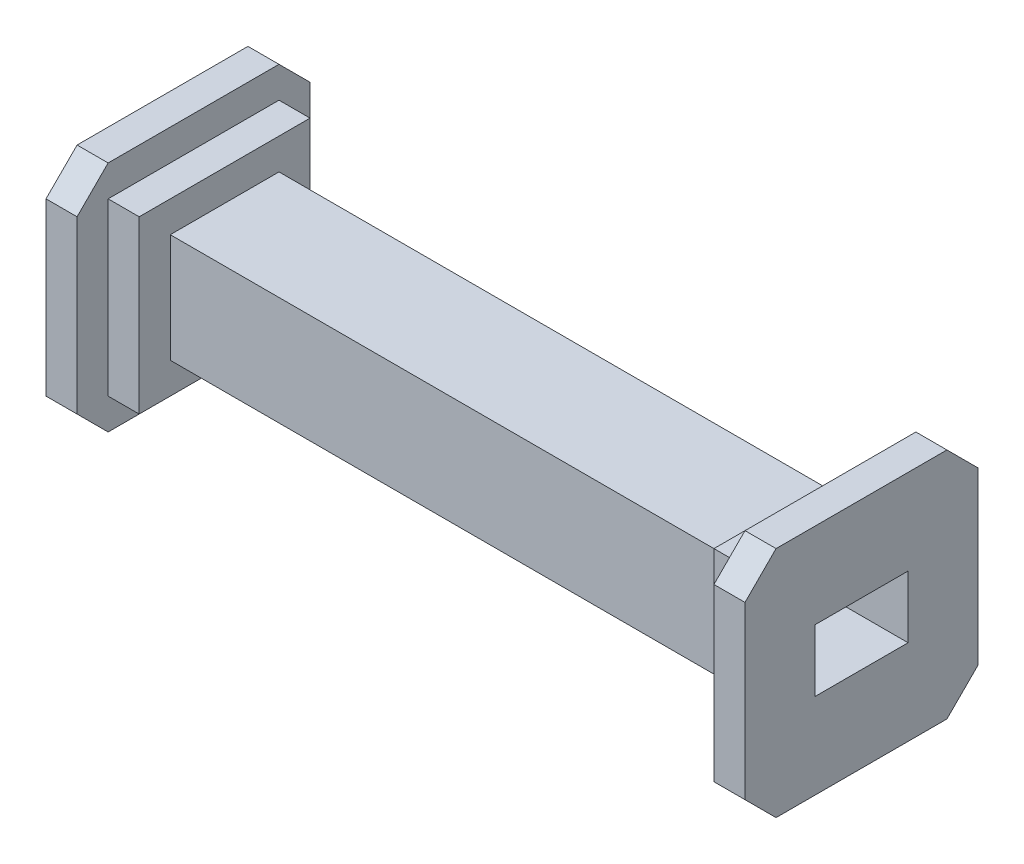
ISO-10303-21;
HEADER;
FILE_DESCRIPTION(('STEP AP214'),'2;1');
FILE_NAME('part.step','',(''),(''),'','','');
FILE_SCHEMA(('AUTOMOTIVE_DESIGN { 1 0 10303 214 1 1 1 1 }'));
ENDSEC;
DATA;
#1=APPLICATION_CONTEXT('core data for automotive mechanical design processes');
#2=APPLICATION_PROTOCOL_DEFINITION('international standard','automotive_design',2000,#1);
#3=PRODUCT_CONTEXT('',#1,'mechanical');
#4=PRODUCT('Part','Part','',(#3));
#5=PRODUCT_RELATED_PRODUCT_CATEGORY('part','',(#4));
#6=PRODUCT_DEFINITION_FORMATION('','',#4);
#7=PRODUCT_DEFINITION_CONTEXT('part definition',#1,'design');
#8=PRODUCT_DEFINITION('design','',#6,#7);
#9=PRODUCT_DEFINITION_SHAPE('','',#8);
#10=(LENGTH_UNIT() NAMED_UNIT(*) SI_UNIT(.MILLI.,.METRE.));
#11=(NAMED_UNIT(*) PLANE_ANGLE_UNIT() SI_UNIT($,.RADIAN.));
#12=(NAMED_UNIT(*) SI_UNIT($,.STERADIAN.) SOLID_ANGLE_UNIT());
#13=UNCERTAINTY_MEASURE_WITH_UNIT(LENGTH_MEASURE(1.E-05),#10,'distance_accuracy_value','');
#14=(GEOMETRIC_REPRESENTATION_CONTEXT(3) GLOBAL_UNCERTAINTY_ASSIGNED_CONTEXT((#13)) GLOBAL_UNIT_ASSIGNED_CONTEXT((#10,
#11,#12)) REPRESENTATION_CONTEXT('',''));
#15=CARTESIAN_POINT('',(0.,0.,0.));
#16=DIRECTION('',(0.,0.,1.));
#17=DIRECTION('',(1.,0.,0.));
#18=AXIS2_PLACEMENT_3D('',#15,#16,#17);
#19=CARTESIAN_POINT('',(5.08,0.,0.));
#20=DIRECTION('',(-1.,0.,0.));
#21=DIRECTION('',(0.,0.,1.));
#22=AXIS2_PLACEMENT_3D('',#19,#20,#21);
#23=PLANE('',#22);
#24=DIRECTION('',(0.,0.,-1.));
#25=VECTOR('',#24,1.);
#26=CARTESIAN_POINT('',(5.08,13.9699999999721,-400000.));
#27=LINE('',#26,#25);
#28=CARTESIAN_POINT('',(5.08,13.9699999999721,13.9699999999721));
#29=VERTEX_POINT('',#28);
#30=CARTESIAN_POINT('',(5.08,13.9699999999721,-13.9699999999721));
#31=VERTEX_POINT('',#30);
#32=EDGE_CURVE('E378',#29,#31,#27,.T.);
#33=ORIENTED_EDGE('',*,*,#32,.T.);
#34=DIRECTION('',(0.,-1.,0.));
#35=VECTOR('',#34,1.);
#36=CARTESIAN_POINT('',(5.08,-291579.045,-13.9699999999721));
#37=LINE('',#36,#35);
#38=CARTESIAN_POINT('',(5.08,-13.9699999999721,-13.9699999999721));
#39=VERTEX_POINT('',#38);
#40=EDGE_CURVE('E400',#31,#39,#37,.T.);
#41=ORIENTED_EDGE('',*,*,#40,.T.);
#42=DIRECTION('',(0.,0.,1.));
#43=VECTOR('',#42,1.);
#44=CARTESIAN_POINT('',(5.08,-13.9699999999721,-400000.));
#45=LINE('',#44,#43);
#46=CARTESIAN_POINT('',(5.08,-13.9699999999721,13.9699999999721));
#47=VERTEX_POINT('',#46);
#48=EDGE_CURVE('E404',#39,#47,#45,.T.);
#49=ORIENTED_EDGE('',*,*,#48,.T.);
#50=DIRECTION('',(0.,1.,0.));
#51=VECTOR('',#50,1.);
#52=CARTESIAN_POINT('',(5.08,-291579.045,13.9699999999721));
#53=LINE('',#52,#51);
#54=EDGE_CURVE('E384',#47,#29,#53,.T.);
#55=ORIENTED_EDGE('',*,*,#54,.T.);
#56=EDGE_LOOP('',(#33,#41,#49,#55));
#57=FACE_BOUND('',#56,.T.);
#58=DIRECTION('',(0.,0.,1.));
#59=VECTOR('',#58,1.);
#60=CARTESIAN_POINT('',(5.08,-19.0499999999929,-400000.));
#61=LINE('',#60,#59);
#62=CARTESIAN_POINT('',(5.08,-19.0499999999929,-13.9699999999721));
#63=VERTEX_POINT('',#62);
#64=CARTESIAN_POINT('',(5.08,-19.0499999999929,13.9699999999721));
#65=VERTEX_POINT('',#64);
#66=EDGE_CURVE('E456',#63,#65,#61,.T.);
#67=ORIENTED_EDGE('',*,*,#66,.F.);
#68=DIRECTION('',(0.,-0.707106781186546,0.70710678118655));
#69=VECTOR('',#68,1.);
#70=CARTESIAN_POINT('',(5.08,-13.97,-19.05));
#71=LINE('',#70,#69);
#72=CARTESIAN_POINT('',(5.08,-13.9699999999721,-19.0499999999929));
#73=VERTEX_POINT('',#72);
#74=EDGE_CURVE('E585',#63,#73,#71,.F.);
#75=ORIENTED_EDGE('',*,*,#74,.T.);
#76=DIRECTION('',(0.,-1.,0.));
#77=VECTOR('',#76,1.);
#78=CARTESIAN_POINT('',(5.08,-291579.045,-19.0499999999929));
#79=LINE('',#78,#77);
#80=CARTESIAN_POINT('',(5.08,13.9699999999721,-19.0499999999929));
#81=VERTEX_POINT('',#80);
#82=EDGE_CURVE('E452',#81,#73,#79,.T.);
#83=ORIENTED_EDGE('',*,*,#82,.F.);
#84=DIRECTION('',(0.,-0.70710678118655,-0.707106781186546));
#85=VECTOR('',#84,1.);
#86=CARTESIAN_POINT('',(5.08,19.05,-13.97));
#87=LINE('',#86,#85);
#88=CARTESIAN_POINT('',(5.08,19.0499999999929,-13.9699999999721));
#89=VERTEX_POINT('',#88);
#90=EDGE_CURVE('E579',#81,#89,#87,.F.);
#91=ORIENTED_EDGE('',*,*,#90,.T.);
#92=DIRECTION('',(0.,0.,-1.));
#93=VECTOR('',#92,1.);
#94=CARTESIAN_POINT('',(5.08,19.0499999999929,-400000.));
#95=LINE('',#94,#93);
#96=CARTESIAN_POINT('',(5.08,19.0499999999929,13.9699999999721));
#97=VERTEX_POINT('',#96);
#98=EDGE_CURVE('E415',#97,#89,#95,.T.);
#99=ORIENTED_EDGE('',*,*,#98,.F.);
#100=DIRECTION('',(0.,0.707106781186547,-0.707106781186549));
#101=VECTOR('',#100,1.);
#102=CARTESIAN_POINT('',(5.08,13.97,19.05));
#103=LINE('',#102,#101);
#104=CARTESIAN_POINT('',(5.08,13.9699999999721,19.0499999999929));
#105=VERTEX_POINT('',#104);
#106=EDGE_CURVE('E62',#97,#105,#103,.F.);
#107=ORIENTED_EDGE('',*,*,#106,.T.);
#108=DIRECTION('',(0.,1.,0.));
#109=VECTOR('',#108,1.);
#110=CARTESIAN_POINT('',(5.08,-291579.045,19.0499999999929));
#111=LINE('',#110,#109);
#112=CARTESIAN_POINT('',(5.08,-13.9699999999721,19.0499999999929));
#113=VERTEX_POINT('',#112);
#114=EDGE_CURVE('E436',#113,#105,#111,.T.);
#115=ORIENTED_EDGE('',*,*,#114,.F.);
#116=DIRECTION('',(0.,0.707106781186549,0.707106781186546));
#117=VECTOR('',#116,1.);
#118=CARTESIAN_POINT('',(5.08,-19.05,13.97));
#119=LINE('',#118,#117);
#120=EDGE_CURVE('E582',#113,#65,#119,.F.);
#121=ORIENTED_EDGE('',*,*,#120,.T.);
#122=EDGE_LOOP('',(#67,#75,#83,#91,#99,#107,#115,#121));
#123=FACE_BOUND('',#122,.T.);
#124=ADVANCED_FACE('F45',(#57,#123),#23,.F.);
#125=CARTESIAN_POINT('',(109.22,13.9699999999721,-400000.));
#126=DIRECTION('',(0.,1.,0.));
#127=DIRECTION('',(0.,0.,1.));
#128=AXIS2_PLACEMENT_3D('',#125,#126,#127);
#129=PLANE('',#128);
#130=DIRECTION('',(0.,0.,1.));
#131=VECTOR('',#130,1.);
#132=CARTESIAN_POINT('',(10.16,13.9699999999721,-400000.));
#133=LINE('',#132,#131);
#134=CARTESIAN_POINT('',(10.16,13.9699999999721,-13.9699999999721));
#135=VERTEX_POINT('',#134);
#136=CARTESIAN_POINT('',(10.16,13.9699999999721,13.9699999999721));
#137=VERTEX_POINT('',#136);
#138=EDGE_CURVE('E375',#135,#137,#133,.T.);
#139=ORIENTED_EDGE('',*,*,#138,.F.);
#140=DIRECTION('',(-1.,0.,0.));
#141=VECTOR('',#140,1.);
#142=CARTESIAN_POINT('',(109.22,13.9699999999721,-13.9699999999721));
#143=LINE('',#142,#141);
#144=EDGE_CURVE('E396',#135,#31,#143,.T.);
#145=ORIENTED_EDGE('',*,*,#144,.T.);
#146=ORIENTED_EDGE('',*,*,#32,.F.);
#147=DIRECTION('',(-1.,0.,0.));
#148=VECTOR('',#147,1.);
#149=CARTESIAN_POINT('',(109.22,13.9699999999721,13.9699999999721));
#150=LINE('',#149,#148);
#151=EDGE_CURVE('E416',#137,#29,#150,.T.);
#152=ORIENTED_EDGE('',*,*,#151,.F.);
#153=EDGE_LOOP('',(#139,#145,#146,#152));
#154=FACE_BOUND('',#153,.T.);
#155=ADVANCED_FACE('F634',(#154),#129,.T.);
#156=CARTESIAN_POINT('',(109.22,-291579.045,13.9699999999721));
#157=DIRECTION('',(0.,0.,1.));
#158=DIRECTION('',(1.,0.,0.));
#159=AXIS2_PLACEMENT_3D('',#156,#157,#158);
#160=PLANE('',#159);
#161=DIRECTION('',(0.,-1.,0.));
#162=VECTOR('',#161,1.);
#163=CARTESIAN_POINT('',(10.16,-291579.045,13.9699999999721));
#164=LINE('',#163,#162);
#165=CARTESIAN_POINT('',(10.16,-13.9699999999721,13.9699999999721));
#166=VERTEX_POINT('',#165);
#167=EDGE_CURVE('E372',#137,#166,#164,.T.);
#168=ORIENTED_EDGE('',*,*,#167,.F.);
#169=ORIENTED_EDGE('',*,*,#151,.T.);
#170=ORIENTED_EDGE('',*,*,#54,.F.);
#171=DIRECTION('',(-1.,0.,0.));
#172=VECTOR('',#171,1.);
#173=CARTESIAN_POINT('',(109.22,-13.9699999999721,13.9699999999721));
#174=LINE('',#173,#172);
#175=EDGE_CURVE('E421',#166,#47,#174,.T.);
#176=ORIENTED_EDGE('',*,*,#175,.F.);
#177=EDGE_LOOP('',(#168,#169,#170,#176));
#178=FACE_BOUND('',#177,.T.);
#179=ADVANCED_FACE('F640',(#178),#160,.T.);
#180=CARTESIAN_POINT('',(109.22,-13.9699999999721,-400000.));
#181=DIRECTION('',(0.,-1.,0.));
#182=DIRECTION('',(0.,0.,-1.));
#183=AXIS2_PLACEMENT_3D('',#180,#181,#182);
#184=PLANE('',#183);
#185=DIRECTION('',(0.,0.,-1.));
#186=VECTOR('',#185,1.);
#187=CARTESIAN_POINT('',(10.16,-13.9699999999721,-400000.));
#188=LINE('',#187,#186);
#189=CARTESIAN_POINT('',(10.16,-13.9699999999721,-13.9699999999721));
#190=VERTEX_POINT('',#189);
#191=EDGE_CURVE('E369',#166,#190,#188,.T.);
#192=ORIENTED_EDGE('',*,*,#191,.F.);
#193=ORIENTED_EDGE('',*,*,#175,.T.);
#194=ORIENTED_EDGE('',*,*,#48,.F.);
#195=DIRECTION('',(-1.,0.,0.));
#196=VECTOR('',#195,1.);
#197=CARTESIAN_POINT('',(109.22,-13.9699999999721,-13.9699999999721));
#198=LINE('',#197,#196);
#199=EDGE_CURVE('E426',#190,#39,#198,.T.);
#200=ORIENTED_EDGE('',*,*,#199,.F.);
#201=EDGE_LOOP('',(#192,#193,#194,#200));
#202=FACE_BOUND('',#201,.T.);
#203=ADVANCED_FACE('F885',(#202),#184,.T.);
#204=CARTESIAN_POINT('',(109.22,-291579.045,-13.9699999999721));
#205=DIRECTION('',(0.,0.,-1.));
#206=DIRECTION('',(-1.,0.,0.));
#207=AXIS2_PLACEMENT_3D('',#204,#205,#206);
#208=PLANE('',#207);
#209=DIRECTION('',(0.,1.,0.));
#210=VECTOR('',#209,1.);
#211=CARTESIAN_POINT('',(10.16,-291579.045,-13.9699999999721));
#212=LINE('',#211,#210);
#213=EDGE_CURVE('E496',#190,#135,#212,.T.);
#214=ORIENTED_EDGE('',*,*,#213,.F.);
#215=ORIENTED_EDGE('',*,*,#199,.T.);
#216=ORIENTED_EDGE('',*,*,#40,.F.);
#217=ORIENTED_EDGE('',*,*,#144,.F.);
#218=EDGE_LOOP('',(#214,#215,#216,#217));
#219=FACE_BOUND('',#218,.T.);
#220=ADVANCED_FACE('F653',(#219),#208,.T.);
#221=CARTESIAN_POINT('',(0.,0.,0.));
#222=DIRECTION('',(-1.,0.,0.));
#223=DIRECTION('',(0.,0.,1.));
#224=AXIS2_PLACEMENT_3D('',#221,#222,#223);
#225=PLANE('',#224);
#226=DIRECTION('',(0.,1.,0.));
#227=VECTOR('',#226,1.);
#228=CARTESIAN_POINT('',(0.,-5.08,7.62));
#229=LINE('',#228,#227);
#230=CARTESIAN_POINT('',(0.,-5.08,7.62));
#231=VERTEX_POINT('',#230);
#232=CARTESIAN_POINT('',(0.,5.08,7.62));
#233=VERTEX_POINT('',#232);
#234=EDGE_CURVE('E265',#231,#233,#229,.T.);
#235=ORIENTED_EDGE('',*,*,#234,.F.);
#236=DIRECTION('',(0.,0.,1.));
#237=VECTOR('',#236,1.);
#238=CARTESIAN_POINT('',(0.,-5.08,-7.62));
#239=LINE('',#238,#237);
#240=CARTESIAN_POINT('',(0.,-5.08,-7.62));
#241=VERTEX_POINT('',#240);
#242=EDGE_CURVE('E286',#241,#231,#239,.T.);
#243=ORIENTED_EDGE('',*,*,#242,.F.);
#244=DIRECTION('',(0.,-1.,0.));
#245=VECTOR('',#244,1.);
#246=CARTESIAN_POINT('',(0.,-5.08,-7.62));
#247=LINE('',#246,#245);
#248=CARTESIAN_POINT('',(0.,5.08,-7.62));
#249=VERTEX_POINT('',#248);
#250=EDGE_CURVE('E290',#249,#241,#247,.T.);
#251=ORIENTED_EDGE('',*,*,#250,.F.);
#252=DIRECTION('',(0.,0.,-1.));
#253=VECTOR('',#252,1.);
#254=CARTESIAN_POINT('',(0.,5.08,-7.62));
#255=LINE('',#254,#253);
#256=EDGE_CURVE('E299',#233,#249,#255,.T.);
#257=ORIENTED_EDGE('',*,*,#256,.F.);
#258=EDGE_LOOP('',(#235,#243,#251,#257));
#259=FACE_BOUND('',#258,.T.);
#260=DIRECTION('',(0.,1.,0.));
#261=VECTOR('',#260,1.);
#262=CARTESIAN_POINT('',(0.,-19.05,-19.05));
#263=LINE('',#262,#261);
#264=CARTESIAN_POINT('',(0.,-13.97,-19.05));
#265=VERTEX_POINT('',#264);
#266=CARTESIAN_POINT('',(0.,13.97,-19.05));
#267=VERTEX_POINT('',#266);
#268=EDGE_CURVE('E448',#265,#267,#263,.T.);
#269=ORIENTED_EDGE('',*,*,#268,.F.);
#270=DIRECTION('',(0.,0.707106781186546,-0.70710678118655));
#271=VECTOR('',#270,1.);
#272=CARTESIAN_POINT('',(0.,-16.51,-16.5099999999999));
#273=LINE('',#272,#271);
#274=CARTESIAN_POINT('',(0.,-19.05,-13.97));
#275=VERTEX_POINT('',#274);
#276=EDGE_CURVE('E567',#265,#275,#273,.F.);
#277=ORIENTED_EDGE('',*,*,#276,.T.);
#278=DIRECTION('',(0.,0.,-1.));
#279=VECTOR('',#278,1.);
#280=CARTESIAN_POINT('',(0.,-19.05,19.05));
#281=LINE('',#280,#279);
#282=CARTESIAN_POINT('',(0.,-19.05,13.97));
#283=VERTEX_POINT('',#282);
#284=EDGE_CURVE('E467',#283,#275,#281,.T.);
#285=ORIENTED_EDGE('',*,*,#284,.F.);
#286=DIRECTION('',(0.,-0.707106781186549,-0.707106781186546));
#287=VECTOR('',#286,1.);
#288=CARTESIAN_POINT('',(0.,-16.5099999999999,16.51));
#289=LINE('',#288,#287);
#290=CARTESIAN_POINT('',(0.,-13.97,19.05));
#291=VERTEX_POINT('',#290);
#292=EDGE_CURVE('E564',#283,#291,#289,.F.);
#293=ORIENTED_EDGE('',*,*,#292,.T.);
#294=DIRECTION('',(0.,-1.,0.));
#295=VECTOR('',#294,1.);
#296=CARTESIAN_POINT('',(0.,-19.05,19.05));
#297=LINE('',#296,#295);
#298=CARTESIAN_POINT('',(0.,13.97,19.05));
#299=VERTEX_POINT('',#298);
#300=EDGE_CURVE('E487',#299,#291,#297,.T.);
#301=ORIENTED_EDGE('',*,*,#300,.F.);
#302=DIRECTION('',(0.,-0.707106781186547,0.707106781186549));
#303=VECTOR('',#302,1.);
#304=CARTESIAN_POINT('',(0.,16.51,16.51));
#305=LINE('',#304,#303);
#306=CARTESIAN_POINT('',(0.,19.05,13.97));
#307=VERTEX_POINT('',#306);
#308=EDGE_CURVE('E558',#299,#307,#305,.F.);
#309=ORIENTED_EDGE('',*,*,#308,.T.);
#310=DIRECTION('',(0.,0.,1.));
#311=VECTOR('',#310,1.);
#312=CARTESIAN_POINT('',(0.,19.05,19.05));
#313=LINE('',#312,#311);
#314=CARTESIAN_POINT('',(0.,19.05,-13.97));
#315=VERTEX_POINT('',#314);
#316=EDGE_CURVE('E483',#315,#307,#313,.T.);
#317=ORIENTED_EDGE('',*,*,#316,.F.);
#318=DIRECTION('',(0.,0.70710678118655,0.707106781186546));
#319=VECTOR('',#318,1.);
#320=CARTESIAN_POINT('',(0.,16.5099999999999,-16.51));
#321=LINE('',#320,#319);
#322=EDGE_CURVE('E561',#315,#267,#321,.F.);
#323=ORIENTED_EDGE('',*,*,#322,.T.);
#324=EDGE_LOOP('',(#269,#277,#285,#293,#301,#309,#317,#323));
#325=FACE_BOUND('',#324,.T.);
#326=ADVANCED_FACE('F608',(#259,#325),#225,.T.);
#327=CARTESIAN_POINT('',(114.3,-19.05,19.05));
#328=DIRECTION('',(0.,1.,0.));
#329=DIRECTION('',(0.,0.,1.));
#330=AXIS2_PLACEMENT_3D('',#327,#328,#329);
#331=PLANE('',#330);
#332=ORIENTED_EDGE('',*,*,#284,.T.);
#333=DIRECTION('',(1.,0.,0.));
#334=VECTOR('',#333,1.);
#335=CARTESIAN_POINT('',(114.3,-19.05,-13.97));
#336=LINE('',#335,#334);
#337=EDGE_CURVE('E574',#275,#63,#336,.T.);
#338=ORIENTED_EDGE('',*,*,#337,.T.);
#339=ORIENTED_EDGE('',*,*,#66,.T.);
#340=DIRECTION('',(-1.,0.,0.));
#341=VECTOR('',#340,1.);
#342=CARTESIAN_POINT('',(114.3,-19.05,13.97));
#343=LINE('',#342,#341);
#344=EDGE_CURVE('E570',#65,#283,#343,.T.);
#345=ORIENTED_EDGE('',*,*,#344,.T.);
#346=EDGE_LOOP('',(#332,#338,#339,#345));
#347=FACE_BOUND('',#346,.T.);
#348=ADVANCED_FACE('F615',(#347),#331,.F.);
#349=CARTESIAN_POINT('',(114.3,-19.05,19.05));
#350=DIRECTION('',(0.,0.,-1.));
#351=DIRECTION('',(-1.,0.,0.));
#352=AXIS2_PLACEMENT_3D('',#349,#350,#351);
#353=PLANE('',#352);
#354=ORIENTED_EDGE('',*,*,#300,.T.);
#355=DIRECTION('',(1.,0.,0.));
#356=VECTOR('',#355,1.);
#357=CARTESIAN_POINT('',(114.3,-13.97,19.05));
#358=LINE('',#357,#356);
#359=EDGE_CURVE('E69',#291,#113,#358,.T.);
#360=ORIENTED_EDGE('',*,*,#359,.T.);
#361=ORIENTED_EDGE('',*,*,#114,.T.);
#362=DIRECTION('',(-1.,0.,0.));
#363=VECTOR('',#362,1.);
#364=CARTESIAN_POINT('',(114.3,13.97,19.05));
#365=LINE('',#364,#363);
#366=EDGE_CURVE('E588',#105,#299,#365,.T.);
#367=ORIENTED_EDGE('',*,*,#366,.T.);
#368=EDGE_LOOP('',(#354,#360,#361,#367));
#369=FACE_BOUND('',#368,.T.);
#370=ADVANCED_FACE('F605',(#369),#353,.F.);
#371=CARTESIAN_POINT('',(114.3,19.05,19.05));
#372=DIRECTION('',(0.,-1.,0.));
#373=DIRECTION('',(0.,0.,-1.));
#374=AXIS2_PLACEMENT_3D('',#371,#372,#373);
#375=PLANE('',#374);
#376=ORIENTED_EDGE('',*,*,#98,.T.);
#377=DIRECTION('',(-1.,0.,0.));
#378=VECTOR('',#377,1.);
#379=CARTESIAN_POINT('',(114.3,19.05,-13.97));
#380=LINE('',#379,#378);
#381=EDGE_CURVE('E11',#89,#315,#380,.T.);
#382=ORIENTED_EDGE('',*,*,#381,.T.);
#383=ORIENTED_EDGE('',*,*,#316,.T.);
#384=DIRECTION('',(1.,0.,0.));
#385=VECTOR('',#384,1.);
#386=CARTESIAN_POINT('',(114.3,19.05,13.97));
#387=LINE('',#386,#385);
#388=EDGE_CURVE('E55',#307,#97,#387,.T.);
#389=ORIENTED_EDGE('',*,*,#388,.T.);
#390=EDGE_LOOP('',(#376,#382,#383,#389));
#391=FACE_BOUND('',#390,.T.);
#392=ADVANCED_FACE('F596',(#391),#375,.F.);
#393=CARTESIAN_POINT('',(114.3,-19.05,-19.05));
#394=DIRECTION('',(0.,0.,1.));
#395=DIRECTION('',(1.,0.,0.));
#396=AXIS2_PLACEMENT_3D('',#393,#394,#395);
#397=PLANE('',#396);
#398=ORIENTED_EDGE('',*,*,#82,.T.);
#399=DIRECTION('',(-1.,0.,0.));
#400=VECTOR('',#399,1.);
#401=CARTESIAN_POINT('',(114.3,-13.97,-19.05));
#402=LINE('',#401,#400);
#403=EDGE_CURVE('E554',#73,#265,#402,.T.);
#404=ORIENTED_EDGE('',*,*,#403,.T.);
#405=ORIENTED_EDGE('',*,*,#268,.T.);
#406=DIRECTION('',(1.,0.,0.));
#407=VECTOR('',#406,1.);
#408=CARTESIAN_POINT('',(114.3,13.97,-19.05));
#409=LINE('',#408,#407);
#410=EDGE_CURVE('E551',#267,#81,#409,.T.);
#411=ORIENTED_EDGE('',*,*,#410,.T.);
#412=EDGE_LOOP('',(#398,#404,#405,#411));
#413=FACE_BOUND('',#412,.T.);
#414=ADVANCED_FACE('F622',(#413),#397,.F.);
#415=CARTESIAN_POINT('',(10.16,0.,0.));
#416=DIRECTION('',(-1.,0.,0.));
#417=DIRECTION('',(0.,0.,1.));
#418=AXIS2_PLACEMENT_3D('',#415,#416,#417);
#419=PLANE('',#418);
#420=ORIENTED_EDGE('',*,*,#138,.T.);
#421=ORIENTED_EDGE('',*,*,#167,.T.);
#422=ORIENTED_EDGE('',*,*,#191,.T.);
#423=ORIENTED_EDGE('',*,*,#213,.T.);
#424=EDGE_LOOP('',(#420,#421,#422,#423));
#425=FACE_BOUND('',#424,.T.);
#426=DIRECTION('',(0.,0.,-1.));
#427=VECTOR('',#426,1.);
#428=CARTESIAN_POINT('',(10.16,8.89,8.89));
#429=LINE('',#428,#427);
#430=CARTESIAN_POINT('',(10.16,8.89,8.89));
#431=VERTEX_POINT('',#430);
#432=CARTESIAN_POINT('',(10.16,8.89,-8.89));
#433=VERTEX_POINT('',#432);
#434=EDGE_CURVE('E308',#431,#433,#429,.T.);
#435=ORIENTED_EDGE('',*,*,#434,.T.);
#436=DIRECTION('',(0.,-1.,0.));
#437=VECTOR('',#436,1.);
#438=CARTESIAN_POINT('',(10.16,8.89,-8.89));
#439=LINE('',#438,#437);
#440=CARTESIAN_POINT('',(10.16,-8.89,-8.89));
#441=VERTEX_POINT('',#440);
#442=EDGE_CURVE('E331',#433,#441,#439,.T.);
#443=ORIENTED_EDGE('',*,*,#442,.T.);
#444=DIRECTION('',(0.,0.,1.));
#445=VECTOR('',#444,1.);
#446=CARTESIAN_POINT('',(10.16,-8.89,-8.89));
#447=LINE('',#446,#445);
#448=CARTESIAN_POINT('',(10.16,-8.89,8.89));
#449=VERTEX_POINT('',#448);
#450=EDGE_CURVE('E335',#441,#449,#447,.T.);
#451=ORIENTED_EDGE('',*,*,#450,.T.);
#452=DIRECTION('',(0.,1.,0.));
#453=VECTOR('',#452,1.);
#454=CARTESIAN_POINT('',(10.16,-8.89,8.89));
#455=LINE('',#454,#453);
#456=EDGE_CURVE('E339',#449,#431,#455,.T.);
#457=ORIENTED_EDGE('',*,*,#456,.T.);
#458=EDGE_LOOP('',(#435,#443,#451,#457));
#459=FACE_BOUND('',#458,.T.);
#460=ADVANCED_FACE('F665',(#425,#459),#419,.F.);
#461=CARTESIAN_POINT('',(158.021536726415,8.89,-8.89));
#462=DIRECTION('',(0.,0.,-1.));
#463=DIRECTION('',(-1.,0.,0.));
#464=AXIS2_PLACEMENT_3D('',#461,#462,#463);
#465=PLANE('',#464);
#466=DIRECTION('',(-1.,0.,0.));
#467=VECTOR('',#466,1.);
#468=CARTESIAN_POINT('',(158.021536726415,-8.89,-8.89));
#469=LINE('',#468,#467);
#470=CARTESIAN_POINT('',(104.14,-8.89,-8.89));
#471=VERTEX_POINT('',#470);
#472=EDGE_CURVE('E350',#471,#441,#469,.T.);
#473=ORIENTED_EDGE('',*,*,#472,.T.);
#474=ORIENTED_EDGE('',*,*,#442,.F.);
#475=DIRECTION('',(-1.,0.,0.));
#476=VECTOR('',#475,1.);
#477=CARTESIAN_POINT('',(158.021536726415,8.89,-8.89));
#478=LINE('',#477,#476);
#479=CARTESIAN_POINT('',(104.14,8.89,-8.89));
#480=VERTEX_POINT('',#479);
#481=EDGE_CURVE('E343',#480,#433,#478,.T.);
#482=ORIENTED_EDGE('',*,*,#481,.F.);
#483=DIRECTION('',(0.,1.,0.));
#484=VECTOR('',#483,1.);
#485=CARTESIAN_POINT('',(104.14,8.89,-8.89));
#486=LINE('',#485,#484);
#487=EDGE_CURVE('E327',#471,#480,#486,.T.);
#488=ORIENTED_EDGE('',*,*,#487,.F.);
#489=EDGE_LOOP('',(#473,#474,#482,#488));
#490=FACE_BOUND('',#489,.T.);
#491=ADVANCED_FACE('F832',(#490),#465,.T.);
#492=CARTESIAN_POINT('',(158.021536726415,-8.89,-8.89));
#493=DIRECTION('',(0.,-1.,0.));
#494=DIRECTION('',(0.,0.,-1.));
#495=AXIS2_PLACEMENT_3D('',#492,#493,#494);
#496=PLANE('',#495);
#497=DIRECTION('',(-1.,0.,0.));
#498=VECTOR('',#497,1.);
#499=CARTESIAN_POINT('',(158.021536726415,-8.89,8.89));
#500=LINE('',#499,#498);
#501=CARTESIAN_POINT('',(104.14,-8.89,8.89));
#502=VERTEX_POINT('',#501);
#503=EDGE_CURVE('E347',#502,#449,#500,.T.);
#504=ORIENTED_EDGE('',*,*,#503,.T.);
#505=ORIENTED_EDGE('',*,*,#450,.F.);
#506=ORIENTED_EDGE('',*,*,#472,.F.);
#507=DIRECTION('',(0.,0.,-1.));
#508=VECTOR('',#507,1.);
#509=CARTESIAN_POINT('',(104.14,-8.89,-8.89));
#510=LINE('',#509,#508);
#511=EDGE_CURVE('E314',#502,#471,#510,.T.);
#512=ORIENTED_EDGE('',*,*,#511,.F.);
#513=EDGE_LOOP('',(#504,#505,#506,#512));
#514=FACE_BOUND('',#513,.T.);
#515=ADVANCED_FACE('F822',(#514),#496,.T.);
#516=CARTESIAN_POINT('',(158.021536726415,-8.89,8.89));
#517=DIRECTION('',(0.,0.,1.));
#518=DIRECTION('',(1.,0.,0.));
#519=AXIS2_PLACEMENT_3D('',#516,#517,#518);
#520=PLANE('',#519);
#521=DIRECTION('',(-1.,0.,0.));
#522=VECTOR('',#521,1.);
#523=CARTESIAN_POINT('',(158.021536726415,8.89,8.89));
#524=LINE('',#523,#522);
#525=CARTESIAN_POINT('',(104.14,8.89,8.89));
#526=VERTEX_POINT('',#525);
#527=EDGE_CURVE('E344',#526,#431,#524,.T.);
#528=ORIENTED_EDGE('',*,*,#527,.T.);
#529=ORIENTED_EDGE('',*,*,#456,.F.);
#530=ORIENTED_EDGE('',*,*,#503,.F.);
#531=DIRECTION('',(0.,-1.,0.));
#532=VECTOR('',#531,1.);
#533=CARTESIAN_POINT('',(104.14,-8.89,8.89));
#534=LINE('',#533,#532);
#535=EDGE_CURVE('E319',#526,#502,#534,.T.);
#536=ORIENTED_EDGE('',*,*,#535,.F.);
#537=EDGE_LOOP('',(#528,#529,#530,#536));
#538=FACE_BOUND('',#537,.T.);
#539=ADVANCED_FACE('F812',(#538),#520,.T.);
#540=CARTESIAN_POINT('',(158.021536726415,8.89,8.89));
#541=DIRECTION('',(0.,1.,0.));
#542=DIRECTION('',(0.,0.,1.));
#543=AXIS2_PLACEMENT_3D('',#540,#541,#542);
#544=PLANE('',#543);
#545=ORIENTED_EDGE('',*,*,#481,.T.);
#546=ORIENTED_EDGE('',*,*,#434,.F.);
#547=ORIENTED_EDGE('',*,*,#527,.F.);
#548=DIRECTION('',(0.,0.,1.));
#549=VECTOR('',#548,1.);
#550=CARTESIAN_POINT('',(104.14,8.89,8.89));
#551=LINE('',#550,#549);
#552=EDGE_CURVE('E323',#480,#526,#551,.T.);
#553=ORIENTED_EDGE('',*,*,#552,.F.);
#554=EDGE_LOOP('',(#545,#546,#547,#553));
#555=FACE_BOUND('',#554,.T.);
#556=ADVANCED_FACE('F802',(#555),#544,.T.);
#557=CARTESIAN_POINT('',(104.14,0.,0.));
#558=DIRECTION('',(-1.,0.,0.));
#559=DIRECTION('',(0.,0.,1.));
#560=AXIS2_PLACEMENT_3D('',#557,#558,#559);
#561=PLANE('',#560);
#562=DIRECTION('',(0.,1.,0.));
#563=VECTOR('',#562,1.);
#564=CARTESIAN_POINT('',(104.14,-291579.045,-13.9699999999721));
#565=LINE('',#564,#563);
#566=CARTESIAN_POINT('',(104.14,-13.9699999999721,-13.9699999999721));
#567=VERTEX_POINT('',#566);
#568=CARTESIAN_POINT('',(104.14,13.9699999999721,-13.9699999999721));
#569=VERTEX_POINT('',#568);
#570=EDGE_CURVE('E479',#567,#569,#565,.T.);
#571=ORIENTED_EDGE('',*,*,#570,.F.);
#572=DIRECTION('',(0.,0.,-1.));
#573=VECTOR('',#572,1.);
#574=CARTESIAN_POINT('',(104.14,-13.9699999999721,-400000.));
#575=LINE('',#574,#573);
#576=CARTESIAN_POINT('',(104.14,-13.9699999999721,13.9699999999721));
#577=VERTEX_POINT('',#576);
#578=EDGE_CURVE('E318',#577,#567,#575,.T.);
#579=ORIENTED_EDGE('',*,*,#578,.F.);
#580=DIRECTION('',(0.,-1.,0.));
#581=VECTOR('',#580,1.);
#582=CARTESIAN_POINT('',(104.14,-291579.045,13.9699999999721));
#583=LINE('',#582,#581);
#584=CARTESIAN_POINT('',(104.14,13.9699999999721,13.9699999999721));
#585=VERTEX_POINT('',#584);
#586=EDGE_CURVE('E361',#585,#577,#583,.T.);
#587=ORIENTED_EDGE('',*,*,#586,.F.);
#588=DIRECTION('',(0.,0.,1.));
#589=VECTOR('',#588,1.);
#590=CARTESIAN_POINT('',(104.14,13.9699999999721,-400000.));
#591=LINE('',#590,#589);
#592=EDGE_CURVE('E365',#569,#585,#591,.T.);
#593=ORIENTED_EDGE('',*,*,#592,.F.);
#594=EDGE_LOOP('',(#571,#579,#587,#593));
#595=FACE_BOUND('',#594,.T.);
#596=ORIENTED_EDGE('',*,*,#487,.T.);
#597=ORIENTED_EDGE('',*,*,#552,.T.);
#598=ORIENTED_EDGE('',*,*,#535,.T.);
#599=ORIENTED_EDGE('',*,*,#511,.T.);
#600=EDGE_LOOP('',(#596,#597,#598,#599));
#601=FACE_BOUND('',#600,.T.);
#602=ADVANCED_FACE('F650',(#595,#601),#561,.T.);
#603=CARTESIAN_POINT('',(114.3,0.,0.));
#604=DIRECTION('',(-1.,0.,0.));
#605=DIRECTION('',(0.,0.,1.));
#606=AXIS2_PLACEMENT_3D('',#603,#604,#605);
#607=PLANE('',#606);
#608=DIRECTION('',(0.,0.,1.));
#609=VECTOR('',#608,1.);
#610=CARTESIAN_POINT('',(114.3,-5.08,-7.62));
#611=LINE('',#610,#609);
#612=CARTESIAN_POINT('',(114.3,-5.08,-7.62));
#613=VERTEX_POINT('',#612);
#614=CARTESIAN_POINT('',(114.3,-5.08,7.62));
#615=VERTEX_POINT('',#614);
#616=EDGE_CURVE('E271',#613,#615,#611,.T.);
#617=ORIENTED_EDGE('',*,*,#616,.T.);
#618=DIRECTION('',(0.,1.,0.));
#619=VECTOR('',#618,1.);
#620=CARTESIAN_POINT('',(114.3,-5.08,7.62));
#621=LINE('',#620,#619);
#622=CARTESIAN_POINT('',(114.3,5.08,7.62));
#623=VERTEX_POINT('',#622);
#624=EDGE_CURVE('E262',#615,#623,#621,.T.);
#625=ORIENTED_EDGE('',*,*,#624,.T.);
#626=DIRECTION('',(0.,0.,-1.));
#627=VECTOR('',#626,1.);
#628=CARTESIAN_POINT('',(114.3,5.08,-7.62));
#629=LINE('',#628,#627);
#630=CARTESIAN_POINT('',(114.3,5.08,-7.62));
#631=VERTEX_POINT('',#630);
#632=EDGE_CURVE('E275',#623,#631,#629,.T.);
#633=ORIENTED_EDGE('',*,*,#632,.T.);
#634=DIRECTION('',(0.,-1.,0.));
#635=VECTOR('',#634,1.);
#636=CARTESIAN_POINT('',(114.3,-5.08,-7.62));
#637=LINE('',#636,#635);
#638=EDGE_CURVE('E280',#631,#613,#637,.T.);
#639=ORIENTED_EDGE('',*,*,#638,.T.);
#640=EDGE_LOOP('',(#617,#625,#633,#639));
#641=FACE_BOUND('',#640,.T.);
#642=DIRECTION('',(0.,-1.,0.));
#643=VECTOR('',#642,1.);
#644=CARTESIAN_POINT('',(114.3,-19.05,19.05));
#645=LINE('',#644,#643);
#646=CARTESIAN_POINT('',(114.3,13.97,19.05));
#647=VERTEX_POINT('',#646);
#648=CARTESIAN_POINT('',(114.3,-13.97,19.05));
#649=VERTEX_POINT('',#648);
#650=EDGE_CURVE('E471',#647,#649,#645,.T.);
#651=ORIENTED_EDGE('',*,*,#650,.T.);
#652=DIRECTION('',(0.,0.707106781186549,0.707106781186546));
#653=VECTOR('',#652,1.);
#654=CARTESIAN_POINT('',(114.3,-19.05,13.97));
#655=LINE('',#654,#653);
#656=CARTESIAN_POINT('',(114.3,-19.05,13.97));
#657=VERTEX_POINT('',#656);
#658=EDGE_CURVE('E534',#649,#657,#655,.F.);
#659=ORIENTED_EDGE('',*,*,#658,.T.);
#660=DIRECTION('',(0.,0.,-1.));
#661=VECTOR('',#660,1.);
#662=CARTESIAN_POINT('',(114.3,-19.05,19.05));
#663=LINE('',#662,#661);
#664=CARTESIAN_POINT('',(114.3,-19.05,-13.97));
#665=VERTEX_POINT('',#664);
#666=EDGE_CURVE('E475',#657,#665,#663,.T.);
#667=ORIENTED_EDGE('',*,*,#666,.T.);
#668=DIRECTION('',(0.,-0.707106781186546,0.70710678118655));
#669=VECTOR('',#668,1.);
#670=CARTESIAN_POINT('',(114.3,-13.97,-19.05));
#671=LINE('',#670,#669);
#672=CARTESIAN_POINT('',(114.3,-13.97,-19.05));
#673=VERTEX_POINT('',#672);
#674=EDGE_CURVE('E525',#665,#673,#671,.F.);
#675=ORIENTED_EDGE('',*,*,#674,.T.);
#676=DIRECTION('',(0.,1.,0.));
#677=VECTOR('',#676,1.);
#678=CARTESIAN_POINT('',(114.3,-19.05,-19.05));
#679=LINE('',#678,#677);
#680=CARTESIAN_POINT('',(114.3,13.97,-19.05));
#681=VERTEX_POINT('',#680);
#682=EDGE_CURVE('E462',#673,#681,#679,.T.);
#683=ORIENTED_EDGE('',*,*,#682,.T.);
#684=DIRECTION('',(0.,-0.70710678118655,-0.707106781186546));
#685=VECTOR('',#684,1.);
#686=CARTESIAN_POINT('',(114.3,19.05,-13.97));
#687=LINE('',#686,#685);
#688=CARTESIAN_POINT('',(114.3,19.05,-13.97));
#689=VERTEX_POINT('',#688);
#690=EDGE_CURVE('E528',#681,#689,#687,.F.);
#691=ORIENTED_EDGE('',*,*,#690,.T.);
#692=DIRECTION('',(0.,0.,1.));
#693=VECTOR('',#692,1.);
#694=CARTESIAN_POINT('',(114.3,19.05,19.05));
#695=LINE('',#694,#693);
#696=CARTESIAN_POINT('',(114.3,19.05,13.97));
#697=VERTEX_POINT('',#696);
#698=EDGE_CURVE('E466',#689,#697,#695,.T.);
#699=ORIENTED_EDGE('',*,*,#698,.T.);
#700=DIRECTION('',(0.,0.707106781186547,-0.707106781186549));
#701=VECTOR('',#700,1.);
#702=CARTESIAN_POINT('',(114.3,13.97,19.05));
#703=LINE('',#702,#701);
#704=EDGE_CURVE('E531',#697,#647,#703,.F.);
#705=ORIENTED_EDGE('',*,*,#704,.T.);
#706=EDGE_LOOP('',(#651,#659,#667,#675,#683,#691,#699,#705));
#707=FACE_BOUND('',#706,.T.);
#708=ADVANCED_FACE('F282',(#641,#707),#607,.F.);
#709=DIRECTION('',(0.,1.,0.));
#710=VECTOR('',#709,1.);
#711=CARTESIAN_POINT('',(109.22,-291579.045,19.0499999999929));
#712=LINE('',#711,#710);
#713=CARTESIAN_POINT('',(109.22,-13.9699999999721,19.0499999999929));
#714=VERTEX_POINT('',#713);
#715=CARTESIAN_POINT('',(109.22,13.9699999999721,19.0499999999929));
#716=VERTEX_POINT('',#715);
#717=EDGE_CURVE('E444',#714,#716,#712,.T.);
#718=ORIENTED_EDGE('',*,*,#717,.F.);
#719=DIRECTION('',(1.,0.,0.));
#720=VECTOR('',#719,1.);
#721=CARTESIAN_POINT('',(114.3,-13.97,19.05));
#722=LINE('',#721,#720);
#723=EDGE_CURVE('E522',#714,#649,#722,.T.);
#724=ORIENTED_EDGE('',*,*,#723,.T.);
#725=ORIENTED_EDGE('',*,*,#650,.F.);
#726=DIRECTION('',(-1.,0.,0.));
#727=VECTOR('',#726,1.);
#728=CARTESIAN_POINT('',(114.3,13.97,19.05));
#729=LINE('',#728,#727);
#730=EDGE_CURVE('E518',#647,#716,#729,.T.);
#731=ORIENTED_EDGE('',*,*,#730,.T.);
#732=EDGE_LOOP('',(#718,#724,#725,#731));
#733=FACE_BOUND('',#732,.T.);
#734=ADVANCED_FACE('F649',(#733),#353,.F.);
#735=ORIENTED_EDGE('',*,*,#666,.F.);
#736=DIRECTION('',(-1.,0.,0.));
#737=VECTOR('',#736,1.);
#738=CARTESIAN_POINT('',(114.3,-19.05,13.97));
#739=LINE('',#738,#737);
#740=CARTESIAN_POINT('',(109.22,-19.0499999999929,13.9699999999721));
#741=VERTEX_POINT('',#740);
#742=EDGE_CURVE('E502',#657,#741,#739,.T.);
#743=ORIENTED_EDGE('',*,*,#742,.T.);
#744=DIRECTION('',(0.,0.,1.));
#745=VECTOR('',#744,1.);
#746=CARTESIAN_POINT('',(109.22,-19.0499999999929,-400000.));
#747=LINE('',#746,#745);
#748=CARTESIAN_POINT('',(109.22,-19.0499999999929,-13.9699999999721));
#749=VERTEX_POINT('',#748);
#750=EDGE_CURVE('E440',#749,#741,#747,.T.);
#751=ORIENTED_EDGE('',*,*,#750,.F.);
#752=DIRECTION('',(1.,0.,0.));
#753=VECTOR('',#752,1.);
#754=CARTESIAN_POINT('',(114.3,-19.05,-13.97));
#755=LINE('',#754,#753);
#756=EDGE_CURVE('E499',#749,#665,#755,.T.);
#757=ORIENTED_EDGE('',*,*,#756,.T.);
#758=EDGE_LOOP('',(#735,#743,#751,#757));
#759=FACE_BOUND('',#758,.T.);
#760=ADVANCED_FACE('F657',(#759),#331,.F.);
#761=DIRECTION('',(0.,-1.,0.));
#762=VECTOR('',#761,1.);
#763=CARTESIAN_POINT('',(109.22,-291579.045,-19.0499999999929));
#764=LINE('',#763,#762);
#765=CARTESIAN_POINT('',(109.22,13.9699999999721,-19.0499999999929));
#766=VERTEX_POINT('',#765);
#767=CARTESIAN_POINT('',(109.22,-13.9699999999721,-19.0499999999929));
#768=VERTEX_POINT('',#767);
#769=EDGE_CURVE('E435',#766,#768,#764,.T.);
#770=ORIENTED_EDGE('',*,*,#769,.F.);
#771=DIRECTION('',(1.,0.,0.));
#772=VECTOR('',#771,1.);
#773=CARTESIAN_POINT('',(114.3,13.97,-19.05));
#774=LINE('',#773,#772);
#775=EDGE_CURVE('E548',#766,#681,#774,.T.);
#776=ORIENTED_EDGE('',*,*,#775,.T.);
#777=ORIENTED_EDGE('',*,*,#682,.F.);
#778=DIRECTION('',(-1.,0.,0.));
#779=VECTOR('',#778,1.);
#780=CARTESIAN_POINT('',(114.3,-13.97,-19.05));
#781=LINE('',#780,#779);
#782=EDGE_CURVE('E544',#673,#768,#781,.T.);
#783=ORIENTED_EDGE('',*,*,#782,.T.);
#784=EDGE_LOOP('',(#770,#776,#777,#783));
#785=FACE_BOUND('',#784,.T.);
#786=ADVANCED_FACE('F666',(#785),#397,.F.);
#787=DIRECTION('',(0.,0.,-1.));
#788=VECTOR('',#787,1.);
#789=CARTESIAN_POINT('',(109.22,19.0499999999929,-400000.));
#790=LINE('',#789,#788);
#791=CARTESIAN_POINT('',(109.22,19.0499999999929,13.9699999999721));
#792=VERTEX_POINT('',#791);
#793=CARTESIAN_POINT('',(109.22,19.0499999999929,-13.9699999999721));
#794=VERTEX_POINT('',#793);
#795=EDGE_CURVE('E431',#792,#794,#790,.T.);
#796=ORIENTED_EDGE('',*,*,#795,.F.);
#797=DIRECTION('',(1.,0.,0.));
#798=VECTOR('',#797,1.);
#799=CARTESIAN_POINT('',(114.3,19.05,13.97));
#800=LINE('',#799,#798);
#801=EDGE_CURVE('E541',#792,#697,#800,.T.);
#802=ORIENTED_EDGE('',*,*,#801,.T.);
#803=ORIENTED_EDGE('',*,*,#698,.F.);
#804=DIRECTION('',(-1.,0.,0.));
#805=VECTOR('',#804,1.);
#806=CARTESIAN_POINT('',(114.3,19.05,-13.97));
#807=LINE('',#806,#805);
#808=EDGE_CURVE('E537',#689,#794,#807,.T.);
#809=ORIENTED_EDGE('',*,*,#808,.T.);
#810=EDGE_LOOP('',(#796,#802,#803,#809));
#811=FACE_BOUND('',#810,.T.);
#812=ADVANCED_FACE('F662',(#811),#375,.F.);
#813=CARTESIAN_POINT('',(109.22,0.,0.));
#814=DIRECTION('',(-1.,0.,0.));
#815=DIRECTION('',(0.,0.,1.));
#816=AXIS2_PLACEMENT_3D('',#813,#814,#815);
#817=PLANE('',#816);
#818=DIRECTION('',(0.,1.,0.));
#819=VECTOR('',#818,1.);
#820=CARTESIAN_POINT('',(109.22,-291579.045,13.9699999999721));
#821=LINE('',#820,#819);
#822=CARTESIAN_POINT('',(109.22,-13.9699999999721,13.9699999999721));
#823=VERTEX_POINT('',#822);
#824=CARTESIAN_POINT('',(109.22,13.9699999999721,13.9699999999721));
#825=VERTEX_POINT('',#824);
#826=EDGE_CURVE('E392',#823,#825,#821,.T.);
#827=ORIENTED_EDGE('',*,*,#826,.F.);
#828=DIRECTION('',(0.,0.,1.));
#829=VECTOR('',#828,1.);
#830=CARTESIAN_POINT('',(109.22,-13.9699999999721,-400000.));
#831=LINE('',#830,#829);
#832=CARTESIAN_POINT('',(109.22,-13.9699999999721,-13.9699999999721));
#833=VERTEX_POINT('',#832);
#834=EDGE_CURVE('E388',#833,#823,#831,.T.);
#835=ORIENTED_EDGE('',*,*,#834,.F.);
#836=DIRECTION('',(0.,-1.,0.));
#837=VECTOR('',#836,1.);
#838=CARTESIAN_POINT('',(109.22,-291579.045,-13.9699999999721));
#839=LINE('',#838,#837);
#840=CARTESIAN_POINT('',(109.22,13.9699999999721,-13.9699999999721));
#841=VERTEX_POINT('',#840);
#842=EDGE_CURVE('E383',#841,#833,#839,.T.);
#843=ORIENTED_EDGE('',*,*,#842,.F.);
#844=DIRECTION('',(0.,0.,-1.));
#845=VECTOR('',#844,1.);
#846=CARTESIAN_POINT('',(109.22,13.9699999999721,-400000.));
#847=LINE('',#846,#845);
#848=EDGE_CURVE('E379',#825,#841,#847,.T.);
#849=ORIENTED_EDGE('',*,*,#848,.F.);
#850=EDGE_LOOP('',(#827,#835,#843,#849));
#851=FACE_BOUND('',#850,.T.);
#852=ORIENTED_EDGE('',*,*,#750,.T.);
#853=DIRECTION('',(0.,-0.707106781186549,-0.707106781186546));
#854=VECTOR('',#853,1.);
#855=CARTESIAN_POINT('',(109.22,-16.5099999999999,16.51));
#856=LINE('',#855,#854);
#857=EDGE_CURVE('E515',#741,#714,#856,.F.);
#858=ORIENTED_EDGE('',*,*,#857,.T.);
#859=ORIENTED_EDGE('',*,*,#717,.T.);
#860=DIRECTION('',(0.,-0.707106781186547,0.707106781186549));
#861=VECTOR('',#860,1.);
#862=CARTESIAN_POINT('',(109.22,16.51,16.51));
#863=LINE('',#862,#861);
#864=EDGE_CURVE('E512',#716,#792,#863,.F.);
#865=ORIENTED_EDGE('',*,*,#864,.T.);
#866=ORIENTED_EDGE('',*,*,#795,.T.);
#867=DIRECTION('',(0.,0.70710678118655,0.707106781186546));
#868=VECTOR('',#867,1.);
#869=CARTESIAN_POINT('',(109.22,16.5099999999999,-16.51));
#870=LINE('',#869,#868);
#871=EDGE_CURVE('E509',#794,#766,#870,.F.);
#872=ORIENTED_EDGE('',*,*,#871,.T.);
#873=ORIENTED_EDGE('',*,*,#769,.T.);
#874=DIRECTION('',(0.,0.707106781186546,-0.70710678118655));
#875=VECTOR('',#874,1.);
#876=CARTESIAN_POINT('',(109.22,-16.51,-16.5099999999999));
#877=LINE('',#876,#875);
#878=EDGE_CURVE('E506',#768,#749,#877,.F.);
#879=ORIENTED_EDGE('',*,*,#878,.T.);
#880=EDGE_LOOP('',(#852,#858,#859,#865,#866,#872,#873,#879));
#881=FACE_BOUND('',#880,.T.);
#882=ADVANCED_FACE('F646',(#851,#881),#817,.T.);
#883=EDGE_CURVE('E422',#833,#567,#198,.T.);
#884=ORIENTED_EDGE('',*,*,#883,.T.);
#885=ORIENTED_EDGE('',*,*,#570,.T.);
#886=EDGE_CURVE('E427',#841,#569,#143,.T.);
#887=ORIENTED_EDGE('',*,*,#886,.F.);
#888=ORIENTED_EDGE('',*,*,#842,.T.);
#889=EDGE_LOOP('',(#884,#885,#887,#888));
#890=FACE_BOUND('',#889,.T.);
#891=ADVANCED_FACE('F882',(#890),#208,.T.);
#892=EDGE_CURVE('E417',#823,#577,#174,.T.);
#893=ORIENTED_EDGE('',*,*,#892,.T.);
#894=ORIENTED_EDGE('',*,*,#578,.T.);
#895=ORIENTED_EDGE('',*,*,#883,.F.);
#896=ORIENTED_EDGE('',*,*,#834,.T.);
#897=EDGE_LOOP('',(#893,#894,#895,#896));
#898=FACE_BOUND('',#897,.T.);
#899=ADVANCED_FACE('F871',(#898),#184,.T.);
#900=EDGE_CURVE('E411',#825,#585,#150,.T.);
#901=ORIENTED_EDGE('',*,*,#900,.T.);
#902=ORIENTED_EDGE('',*,*,#586,.T.);
#903=ORIENTED_EDGE('',*,*,#892,.F.);
#904=ORIENTED_EDGE('',*,*,#826,.T.);
#905=EDGE_LOOP('',(#901,#902,#903,#904));
#906=FACE_BOUND('',#905,.T.);
#907=ADVANCED_FACE('F861',(#906),#160,.T.);
#908=ORIENTED_EDGE('',*,*,#886,.T.);
#909=ORIENTED_EDGE('',*,*,#592,.T.);
#910=ORIENTED_EDGE('',*,*,#900,.F.);
#911=ORIENTED_EDGE('',*,*,#848,.T.);
#912=EDGE_LOOP('',(#908,#909,#910,#911));
#913=FACE_BOUND('',#912,.T.);
#914=ADVANCED_FACE('F643',(#913),#129,.T.);
#915=CARTESIAN_POINT('',(114.3,-5.08,7.62));
#916=DIRECTION('',(0.,0.,1.));
#917=DIRECTION('',(1.,0.,0.));
#918=AXIS2_PLACEMENT_3D('',#915,#916,#917);
#919=PLANE('',#918);
#920=ORIENTED_EDGE('',*,*,#234,.T.);
#921=DIRECTION('',(-1.,0.,0.));
#922=VECTOR('',#921,1.);
#923=CARTESIAN_POINT('',(114.3,5.08,7.62));
#924=LINE('',#923,#922);
#925=EDGE_CURVE('E258',#623,#233,#924,.T.);
#926=ORIENTED_EDGE('',*,*,#925,.F.);
#927=ORIENTED_EDGE('',*,*,#624,.F.);
#928=DIRECTION('',(-1.,0.,0.));
#929=VECTOR('',#928,1.);
#930=CARTESIAN_POINT('',(114.3,-5.08,7.62));
#931=LINE('',#930,#929);
#932=EDGE_CURVE('E305',#615,#231,#931,.T.);
#933=ORIENTED_EDGE('',*,*,#932,.T.);
#934=EDGE_LOOP('',(#920,#926,#927,#933));
#935=FACE_BOUND('',#934,.T.);
#936=ADVANCED_FACE('F260',(#935),#919,.F.);
#937=CARTESIAN_POINT('',(114.3,-5.08,-7.62));
#938=DIRECTION('',(0.,-1.,0.));
#939=DIRECTION('',(0.,0.,-1.));
#940=AXIS2_PLACEMENT_3D('',#937,#938,#939);
#941=PLANE('',#940);
#942=ORIENTED_EDGE('',*,*,#242,.T.);
#943=ORIENTED_EDGE('',*,*,#932,.F.);
#944=ORIENTED_EDGE('',*,*,#616,.F.);
#945=DIRECTION('',(-1.,0.,0.));
#946=VECTOR('',#945,1.);
#947=CARTESIAN_POINT('',(114.3,-5.08,-7.62));
#948=LINE('',#947,#946);
#949=EDGE_CURVE('E309',#613,#241,#948,.T.);
#950=ORIENTED_EDGE('',*,*,#949,.T.);
#951=EDGE_LOOP('',(#942,#943,#944,#950));
#952=FACE_BOUND('',#951,.T.);
#953=ADVANCED_FACE('F775',(#952),#941,.F.);
#954=CARTESIAN_POINT('',(114.3,-5.08,-7.62));
#955=DIRECTION('',(0.,0.,-1.));
#956=DIRECTION('',(-1.,0.,0.));
#957=AXIS2_PLACEMENT_3D('',#954,#955,#956);
#958=PLANE('',#957);
#959=ORIENTED_EDGE('',*,*,#250,.T.);
#960=ORIENTED_EDGE('',*,*,#949,.F.);
#961=ORIENTED_EDGE('',*,*,#638,.F.);
#962=DIRECTION('',(-1.,0.,0.));
#963=VECTOR('',#962,1.);
#964=CARTESIAN_POINT('',(114.3,5.08,-7.62));
#965=LINE('',#964,#963);
#966=EDGE_CURVE('E270',#631,#249,#965,.T.);
#967=ORIENTED_EDGE('',*,*,#966,.T.);
#968=EDGE_LOOP('',(#959,#960,#961,#967));
#969=FACE_BOUND('',#968,.T.);
#970=ADVANCED_FACE('F766',(#969),#958,.F.);
#971=CARTESIAN_POINT('',(114.3,5.08,-7.62));
#972=DIRECTION('',(0.,1.,0.));
#973=DIRECTION('',(0.,0.,1.));
#974=AXIS2_PLACEMENT_3D('',#971,#972,#973);
#975=PLANE('',#974);
#976=ORIENTED_EDGE('',*,*,#256,.T.);
#977=ORIENTED_EDGE('',*,*,#966,.F.);
#978=ORIENTED_EDGE('',*,*,#632,.F.);
#979=ORIENTED_EDGE('',*,*,#925,.T.);
#980=EDGE_LOOP('',(#976,#977,#978,#979));
#981=FACE_BOUND('',#980,.T.);
#982=ADVANCED_FACE('F276',(#981),#975,.F.);
#983=CARTESIAN_POINT('',(114.3,-19.05,13.97));
#984=DIRECTION('',(0.,0.707106781186546,-0.707106781186549));
#985=DIRECTION('',(-1.,0.,0.));
#986=AXIS2_PLACEMENT_3D('',#983,#984,#985);
#987=PLANE('',#986);
#988=ORIENTED_EDGE('',*,*,#658,.F.);
#989=ORIENTED_EDGE('',*,*,#723,.F.);
#990=ORIENTED_EDGE('',*,*,#857,.F.);
#991=ORIENTED_EDGE('',*,*,#742,.F.);
#992=EDGE_LOOP('',(#988,#989,#990,#991));
#993=FACE_BOUND('',#992,.T.);
#994=ADVANCED_FACE('F668',(#993),#987,.F.);
#995=CARTESIAN_POINT('',(114.3,13.97,19.05));
#996=DIRECTION('',(0.,-0.707106781186549,-0.707106781186547));
#997=DIRECTION('',(-1.,0.,0.));
#998=AXIS2_PLACEMENT_3D('',#995,#996,#997);
#999=PLANE('',#998);
#1000=ORIENTED_EDGE('',*,*,#704,.F.);
#1001=ORIENTED_EDGE('',*,*,#801,.F.);
#1002=ORIENTED_EDGE('',*,*,#864,.F.);
#1003=ORIENTED_EDGE('',*,*,#730,.F.);
#1004=EDGE_LOOP('',(#1000,#1001,#1002,#1003));
#1005=FACE_BOUND('',#1004,.T.);
#1006=ADVANCED_FACE('F674',(#1005),#999,.F.);
#1007=CARTESIAN_POINT('',(114.3,19.05,-13.97));
#1008=DIRECTION('',(0.,-0.707106781186546,0.70710678118655));
#1009=DIRECTION('',(-1.,0.,0.));
#1010=AXIS2_PLACEMENT_3D('',#1007,#1008,#1009);
#1011=PLANE('',#1010);
#1012=ORIENTED_EDGE('',*,*,#690,.F.);
#1013=ORIENTED_EDGE('',*,*,#775,.F.);
#1014=ORIENTED_EDGE('',*,*,#871,.F.);
#1015=ORIENTED_EDGE('',*,*,#808,.F.);
#1016=EDGE_LOOP('',(#1012,#1013,#1014,#1015));
#1017=FACE_BOUND('',#1016,.T.);
#1018=ADVANCED_FACE('F681',(#1017),#1011,.F.);
#1019=CARTESIAN_POINT('',(114.3,-13.97,-19.05));
#1020=DIRECTION('',(0.,0.70710678118655,0.707106781186546));
#1021=DIRECTION('',(-1.,0.,0.));
#1022=AXIS2_PLACEMENT_3D('',#1019,#1020,#1021);
#1023=PLANE('',#1022);
#1024=ORIENTED_EDGE('',*,*,#674,.F.);
#1025=ORIENTED_EDGE('',*,*,#756,.F.);
#1026=ORIENTED_EDGE('',*,*,#878,.F.);
#1027=ORIENTED_EDGE('',*,*,#782,.F.);
#1028=EDGE_LOOP('',(#1024,#1025,#1026,#1027));
#1029=FACE_BOUND('',#1028,.T.);
#1030=ADVANCED_FACE('F688',(#1029),#1023,.F.);
#1031=CARTESIAN_POINT('',(114.3,-13.97,-19.05));
#1032=DIRECTION('',(0.,0.70710678118655,0.707106781186546));
#1033=DIRECTION('',(-1.,0.,0.));
#1034=AXIS2_PLACEMENT_3D('',#1031,#1032,#1033);
#1035=PLANE('',#1034);
#1036=ORIENTED_EDGE('',*,*,#74,.F.);
#1037=ORIENTED_EDGE('',*,*,#337,.F.);
#1038=ORIENTED_EDGE('',*,*,#276,.F.);
#1039=ORIENTED_EDGE('',*,*,#403,.F.);
#1040=EDGE_LOOP('',(#1036,#1037,#1038,#1039));
#1041=FACE_BOUND('',#1040,.T.);
#1042=ADVANCED_FACE('F620',(#1041),#1035,.F.);
#1043=CARTESIAN_POINT('',(114.3,-19.05,13.97));
#1044=DIRECTION('',(0.,0.707106781186546,-0.707106781186549));
#1045=DIRECTION('',(-1.,0.,0.));
#1046=AXIS2_PLACEMENT_3D('',#1043,#1044,#1045);
#1047=PLANE('',#1046);
#1048=ORIENTED_EDGE('',*,*,#120,.F.);
#1049=ORIENTED_EDGE('',*,*,#359,.F.);
#1050=ORIENTED_EDGE('',*,*,#292,.F.);
#1051=ORIENTED_EDGE('',*,*,#344,.F.);
#1052=EDGE_LOOP('',(#1048,#1049,#1050,#1051));
#1053=FACE_BOUND('',#1052,.T.);
#1054=ADVANCED_FACE('F613',(#1053),#1047,.F.);
#1055=CARTESIAN_POINT('',(114.3,19.05,-13.97));
#1056=DIRECTION('',(0.,-0.707106781186546,0.70710678118655));
#1057=DIRECTION('',(-1.,0.,0.));
#1058=AXIS2_PLACEMENT_3D('',#1055,#1056,#1057);
#1059=PLANE('',#1058);
#1060=ORIENTED_EDGE('',*,*,#90,.F.);
#1061=ORIENTED_EDGE('',*,*,#410,.F.);
#1062=ORIENTED_EDGE('',*,*,#322,.F.);
#1063=ORIENTED_EDGE('',*,*,#381,.F.);
#1064=EDGE_LOOP('',(#1060,#1061,#1062,#1063));
#1065=FACE_BOUND('',#1064,.T.);
#1066=ADVANCED_FACE('F625',(#1065),#1059,.F.);
#1067=CARTESIAN_POINT('',(114.3,13.97,19.05));
#1068=DIRECTION('',(0.,-0.707106781186549,-0.707106781186547));
#1069=DIRECTION('',(-1.,0.,0.));
#1070=AXIS2_PLACEMENT_3D('',#1067,#1068,#1069);
#1071=PLANE('',#1070);
#1072=ORIENTED_EDGE('',*,*,#106,.F.);
#1073=ORIENTED_EDGE('',*,*,#388,.F.);
#1074=ORIENTED_EDGE('',*,*,#308,.F.);
#1075=ORIENTED_EDGE('',*,*,#366,.F.);
#1076=EDGE_LOOP('',(#1072,#1073,#1074,#1075));
#1077=FACE_BOUND('',#1076,.T.);
#1078=ADVANCED_FACE('F48',(#1077),#1071,.F.);
#1079=CLOSED_SHELL('',(#124,#155,#179,#203,#220,#326,#348,#370,#392,#414,#460,#491,#515,#539,
#556,#602,#708,#734,#760,#786,#812,#882,#891,#899,#907,#914,#936,#953,#970,#982,#994,#1006,
#1018,#1030,#1042,#1054,#1066,#1078));
#1080=MANIFOLD_SOLID_BREP('B2',#1079);
#1081=ADVANCED_BREP_SHAPE_REPRESENTATION('',(#18,#1080),#14);
#1082=SHAPE_DEFINITION_REPRESENTATION(#9,#1081);
ENDSEC;
END-ISO-10303-21;
